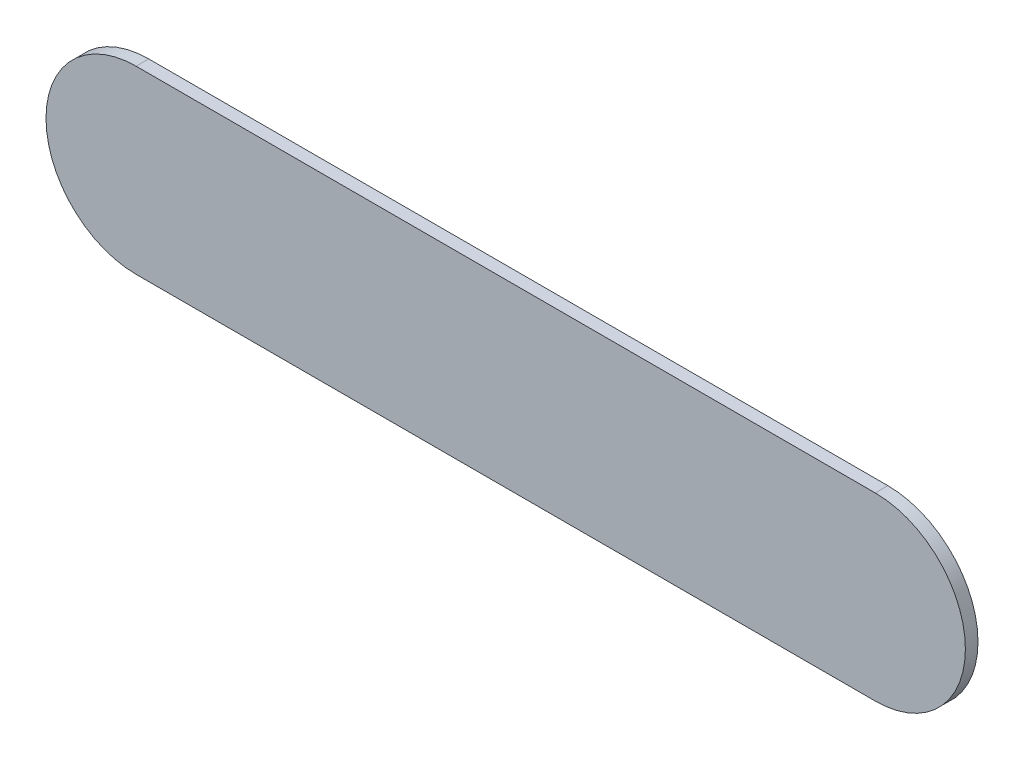
ISO-10303-21;
HEADER;
FILE_DESCRIPTION(('STEP AP214'),'2;1');
FILE_NAME('part.step','',(''),(''),'','','');
FILE_SCHEMA(('AUTOMOTIVE_DESIGN { 1 0 10303 214 1 1 1 1 }'));
ENDSEC;
DATA;
#1=APPLICATION_CONTEXT('core data for automotive mechanical design processes');
#2=APPLICATION_PROTOCOL_DEFINITION('international standard','automotive_design',2000,#1);
#3=PRODUCT_CONTEXT('',#1,'mechanical');
#4=PRODUCT('Part','Part','',(#3));
#5=PRODUCT_RELATED_PRODUCT_CATEGORY('part','',(#4));
#6=PRODUCT_DEFINITION_FORMATION('','',#4);
#7=PRODUCT_DEFINITION_CONTEXT('part definition',#1,'design');
#8=PRODUCT_DEFINITION('design','',#6,#7);
#9=PRODUCT_DEFINITION_SHAPE('','',#8);
#10=(LENGTH_UNIT() NAMED_UNIT(*) SI_UNIT(.MILLI.,.METRE.));
#11=(NAMED_UNIT(*) PLANE_ANGLE_UNIT() SI_UNIT($,.RADIAN.));
#12=(NAMED_UNIT(*) SI_UNIT($,.STERADIAN.) SOLID_ANGLE_UNIT());
#13=UNCERTAINTY_MEASURE_WITH_UNIT(LENGTH_MEASURE(1.E-05),#10,'distance_accuracy_value','');
#14=(GEOMETRIC_REPRESENTATION_CONTEXT(3) GLOBAL_UNCERTAINTY_ASSIGNED_CONTEXT((#13)) GLOBAL_UNIT_ASSIGNED_CONTEXT((#10,
#11,#12)) REPRESENTATION_CONTEXT('',''));
#15=CARTESIAN_POINT('',(0.,0.,0.));
#16=DIRECTION('',(0.,0.,1.));
#17=DIRECTION('',(1.,0.,0.));
#18=AXIS2_PLACEMENT_3D('',#15,#16,#17);
#19=CARTESIAN_POINT('',(111.66,-129.61,1.635));
#20=DIRECTION('',(0.,0.,1.));
#21=DIRECTION('',(1.,0.,0.));
#22=AXIS2_PLACEMENT_3D('',#19,#20,#21);
#23=PLANE('',#22);
#24=DIRECTION('',(-1.,0.,0.));
#25=VECTOR('',#24,1.);
#26=CARTESIAN_POINT('',(111.66,-129.61,1.635));
#27=LINE('',#26,#25);
#28=CARTESIAN_POINT('',(111.66,-129.61,1.635));
#29=VERTEX_POINT('',#28);
#30=CARTESIAN_POINT('',(109.61,-129.61,1.635));
#31=VERTEX_POINT('',#30);
#32=EDGE_CURVE('E98',#29,#31,#27,.T.);
#33=ORIENTED_EDGE('',*,*,#32,.T.);
#34=CARTESIAN_POINT('',(109.61,-129.86,1.635));
#35=DIRECTION('',(0.,0.,1.));
#36=DIRECTION('',(0.,1.,0.));
#37=AXIS2_PLACEMENT_3D('',#34,#35,#36);
#38=CIRCLE('',#37,0.25);
#39=CARTESIAN_POINT('',(109.61,-130.11,1.635));
#40=VERTEX_POINT('',#39);
#41=EDGE_CURVE('E77',#31,#40,#38,.T.);
#42=ORIENTED_EDGE('',*,*,#41,.T.);
#43=DIRECTION('',(1.,0.,0.));
#44=VECTOR('',#43,1.);
#45=CARTESIAN_POINT('',(109.61,-130.11,1.635));
#46=LINE('',#45,#44);
#47=CARTESIAN_POINT('',(111.66,-130.11,1.635));
#48=VERTEX_POINT('',#47);
#49=EDGE_CURVE('E82',#40,#48,#46,.T.);
#50=ORIENTED_EDGE('',*,*,#49,.T.);
#51=CARTESIAN_POINT('',(111.66,-129.86,1.635));
#52=DIRECTION('',(0.,0.,1.));
#53=DIRECTION('',(0.,-1.,0.));
#54=AXIS2_PLACEMENT_3D('',#51,#52,#53);
#55=CIRCLE('',#54,0.25);
#56=EDGE_CURVE('E11',#48,#29,#55,.T.);
#57=ORIENTED_EDGE('',*,*,#56,.T.);
#58=EDGE_LOOP('',(#33,#42,#50,#57));
#59=FACE_BOUND('',#58,.T.);
#60=ADVANCED_FACE('F17',(#59),#23,.T.);
#61=CARTESIAN_POINT('',(111.66,-129.61,1.6));
#62=DIRECTION('',(0.,0.,1.));
#63=DIRECTION('',(1.,0.,0.));
#64=AXIS2_PLACEMENT_3D('',#61,#62,#63);
#65=PLANE('',#64);
#66=CARTESIAN_POINT('',(111.66,-129.86,1.6));
#67=DIRECTION('',(0.,0.,1.));
#68=DIRECTION('',(0.,-1.,0.));
#69=AXIS2_PLACEMENT_3D('',#66,#67,#68);
#70=CIRCLE('',#69,0.25);
#71=CARTESIAN_POINT('',(111.66,-130.11,1.6));
#72=VERTEX_POINT('',#71);
#73=CARTESIAN_POINT('',(111.66,-129.61,1.6));
#74=VERTEX_POINT('',#73);
#75=EDGE_CURVE('E25',#72,#74,#70,.T.);
#76=ORIENTED_EDGE('',*,*,#75,.F.);
#77=DIRECTION('',(1.,0.,0.));
#78=VECTOR('',#77,1.);
#79=CARTESIAN_POINT('',(109.61,-130.11,1.6));
#80=LINE('',#79,#78);
#81=CARTESIAN_POINT('',(109.61,-130.11,1.6));
#82=VERTEX_POINT('',#81);
#83=EDGE_CURVE('E67',#82,#72,#80,.T.);
#84=ORIENTED_EDGE('',*,*,#83,.F.);
#85=CARTESIAN_POINT('',(109.61,-129.86,1.6));
#86=DIRECTION('',(0.,0.,1.));
#87=DIRECTION('',(0.,1.,0.));
#88=AXIS2_PLACEMENT_3D('',#85,#86,#87);
#89=CIRCLE('',#88,0.25);
#90=CARTESIAN_POINT('',(109.61,-129.61,1.6));
#91=VERTEX_POINT('',#90);
#92=EDGE_CURVE('E71',#91,#82,#89,.T.);
#93=ORIENTED_EDGE('',*,*,#92,.F.);
#94=DIRECTION('',(-1.,0.,0.));
#95=VECTOR('',#94,1.);
#96=CARTESIAN_POINT('',(111.66,-129.61,1.6));
#97=LINE('',#96,#95);
#98=EDGE_CURVE('E114',#74,#91,#97,.T.);
#99=ORIENTED_EDGE('',*,*,#98,.F.);
#100=EDGE_LOOP('',(#76,#84,#93,#99));
#101=FACE_BOUND('',#100,.T.);
#102=ADVANCED_FACE('F69',(#101),#65,.F.);
#103=CARTESIAN_POINT('',(111.66,-129.86,1.6));
#104=DIRECTION('',(0.,0.,-1.));
#105=DIRECTION('',(0.,-1.,0.));
#106=AXIS2_PLACEMENT_3D('',#103,#104,#105);
#107=CYLINDRICAL_SURFACE('',#106,0.25);
#108=ORIENTED_EDGE('',*,*,#75,.T.);
#109=DIRECTION('',(0.,0.,1.));
#110=VECTOR('',#109,1.);
#111=CARTESIAN_POINT('',(111.66,-129.61,1.6));
#112=LINE('',#111,#110);
#113=EDGE_CURVE('E92',#74,#29,#112,.T.);
#114=ORIENTED_EDGE('',*,*,#113,.T.);
#115=ORIENTED_EDGE('',*,*,#56,.F.);
#116=DIRECTION('',(0.,0.,1.));
#117=VECTOR('',#116,1.);
#118=CARTESIAN_POINT('',(111.66,-130.11,1.6));
#119=LINE('',#118,#117);
#120=EDGE_CURVE('E76',#72,#48,#119,.T.);
#121=ORIENTED_EDGE('',*,*,#120,.F.);
#122=EDGE_LOOP('',(#108,#114,#115,#121));
#123=FACE_BOUND('',#122,.T.);
#124=ADVANCED_FACE('F126',(#123),#107,.T.);
#125=CARTESIAN_POINT('',(109.61,-130.11,1.6));
#126=DIRECTION('',(0.,1.,0.));
#127=DIRECTION('',(1.,0.,0.));
#128=AXIS2_PLACEMENT_3D('',#125,#126,#127);
#129=PLANE('',#128);
#130=ORIENTED_EDGE('',*,*,#83,.T.);
#131=ORIENTED_EDGE('',*,*,#120,.T.);
#132=ORIENTED_EDGE('',*,*,#49,.F.);
#133=DIRECTION('',(0.,0.,1.));
#134=VECTOR('',#133,1.);
#135=CARTESIAN_POINT('',(109.61,-130.11,1.6));
#136=LINE('',#135,#134);
#137=EDGE_CURVE('E80',#82,#40,#136,.T.);
#138=ORIENTED_EDGE('',*,*,#137,.F.);
#139=EDGE_LOOP('',(#130,#131,#132,#138));
#140=FACE_BOUND('',#139,.T.);
#141=ADVANCED_FACE('F81',(#140),#129,.F.);
#142=CARTESIAN_POINT('',(109.61,-129.86,1.6));
#143=DIRECTION('',(0.,0.,-1.));
#144=DIRECTION('',(0.,1.,0.));
#145=AXIS2_PLACEMENT_3D('',#142,#143,#144);
#146=CYLINDRICAL_SURFACE('',#145,0.25);
#147=ORIENTED_EDGE('',*,*,#92,.T.);
#148=ORIENTED_EDGE('',*,*,#137,.T.);
#149=ORIENTED_EDGE('',*,*,#41,.F.);
#150=DIRECTION('',(0.,0.,1.));
#151=VECTOR('',#150,1.);
#152=CARTESIAN_POINT('',(109.61,-129.61,1.6));
#153=LINE('',#152,#151);
#154=EDGE_CURVE('E89',#91,#31,#153,.T.);
#155=ORIENTED_EDGE('',*,*,#154,.F.);
#156=EDGE_LOOP('',(#147,#148,#149,#155));
#157=FACE_BOUND('',#156,.T.);
#158=ADVANCED_FACE('F87',(#157),#146,.T.);
#159=CARTESIAN_POINT('',(111.66,-129.61,1.6));
#160=DIRECTION('',(0.,-1.,0.));
#161=DIRECTION('',(0.,0.,-1.));
#162=AXIS2_PLACEMENT_3D('',#159,#160,#161);
#163=PLANE('',#162);
#164=ORIENTED_EDGE('',*,*,#98,.T.);
#165=ORIENTED_EDGE('',*,*,#154,.T.);
#166=ORIENTED_EDGE('',*,*,#32,.F.);
#167=ORIENTED_EDGE('',*,*,#113,.F.);
#168=EDGE_LOOP('',(#164,#165,#166,#167));
#169=FACE_BOUND('',#168,.T.);
#170=ADVANCED_FACE('F125',(#169),#163,.F.);
#171=CLOSED_SHELL('',(#60,#102,#124,#141,#158,#170));
#172=MANIFOLD_SOLID_BREP('B1',#171);
#173=ADVANCED_BREP_SHAPE_REPRESENTATION('',(#18,#172),#14);
#174=SHAPE_DEFINITION_REPRESENTATION(#9,#173);
ENDSEC;
END-ISO-10303-21;
